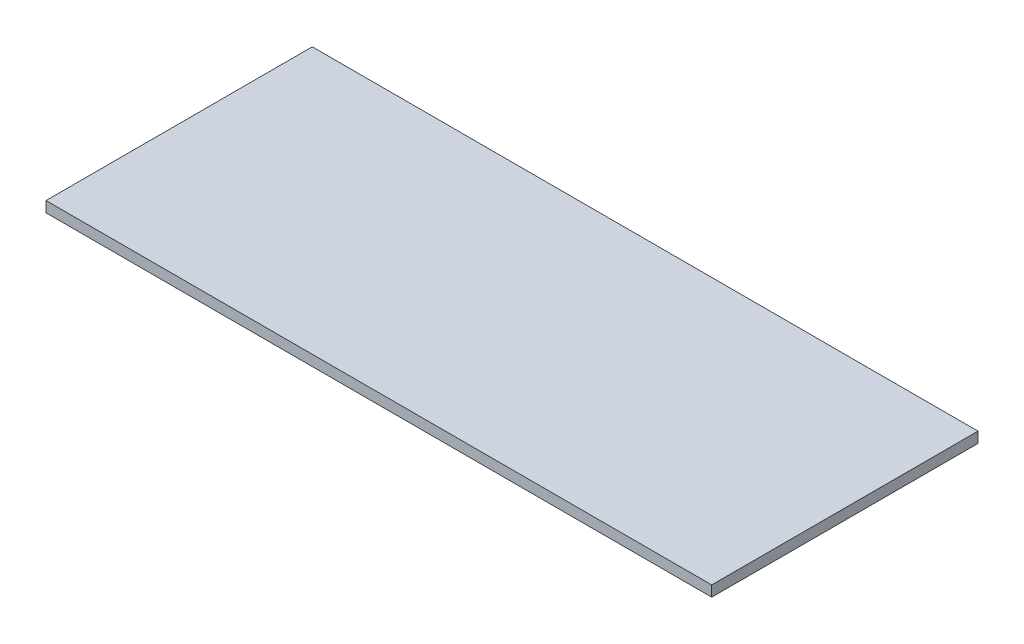
ISO-10303-21;
HEADER;
FILE_DESCRIPTION(('STEP AP214'),'2;1');
FILE_NAME('part.step','',(''),(''),'','','');
FILE_SCHEMA(('AUTOMOTIVE_DESIGN { 1 0 10303 214 1 1 1 1 }'));
ENDSEC;
DATA;
#1=APPLICATION_CONTEXT('core data for automotive mechanical design processes');
#2=APPLICATION_PROTOCOL_DEFINITION('international standard','automotive_design',2000,#1);
#3=PRODUCT_CONTEXT('',#1,'mechanical');
#4=PRODUCT('Part','Part','',(#3));
#5=PRODUCT_RELATED_PRODUCT_CATEGORY('part','',(#4));
#6=PRODUCT_DEFINITION_FORMATION('','',#4);
#7=PRODUCT_DEFINITION_CONTEXT('part definition',#1,'design');
#8=PRODUCT_DEFINITION('design','',#6,#7);
#9=PRODUCT_DEFINITION_SHAPE('','',#8);
#10=(LENGTH_UNIT() NAMED_UNIT(*) SI_UNIT(.MILLI.,.METRE.));
#11=(NAMED_UNIT(*) PLANE_ANGLE_UNIT() SI_UNIT($,.RADIAN.));
#12=(NAMED_UNIT(*) SI_UNIT($,.STERADIAN.) SOLID_ANGLE_UNIT());
#13=UNCERTAINTY_MEASURE_WITH_UNIT(LENGTH_MEASURE(1.E-05),#10,'distance_accuracy_value','');
#14=(GEOMETRIC_REPRESENTATION_CONTEXT(3) GLOBAL_UNCERTAINTY_ASSIGNED_CONTEXT((#13)) GLOBAL_UNIT_ASSIGNED_CONTEXT((#10,
#11,#12)) REPRESENTATION_CONTEXT('',''));
#15=CARTESIAN_POINT('',(0.,0.,0.));
#16=DIRECTION('',(0.,0.,1.));
#17=DIRECTION('',(1.,0.,0.));
#18=AXIS2_PLACEMENT_3D('',#15,#16,#17);
#19=CARTESIAN_POINT('',(0.,20.,0.));
#20=DIRECTION('',(1.,0.,0.));
#21=DIRECTION('',(0.,0.,-1.));
#22=AXIS2_PLACEMENT_3D('',#19,#20,#21);
#23=PLANE('',#22);
#24=DIRECTION('',(0.,0.,1.));
#25=VECTOR('',#24,1.);
#26=CARTESIAN_POINT('',(0.,0.,0.));
#27=LINE('',#26,#25);
#28=CARTESIAN_POINT('',(0.,0.,-500.));
#29=VERTEX_POINT('',#28);
#30=CARTESIAN_POINT('',(0.,0.,0.));
#31=VERTEX_POINT('',#30);
#32=EDGE_CURVE('E98',#29,#31,#27,.T.);
#33=ORIENTED_EDGE('',*,*,#32,.T.);
#34=DIRECTION('',(0.,-1.,0.));
#35=VECTOR('',#34,1.);
#36=CARTESIAN_POINT('',(0.,20.,0.));
#37=LINE('',#36,#35);
#38=CARTESIAN_POINT('',(0.,20.,0.));
#39=VERTEX_POINT('',#38);
#40=EDGE_CURVE('E11',#39,#31,#37,.T.);
#41=ORIENTED_EDGE('',*,*,#40,.F.);
#42=DIRECTION('',(0.,0.,1.));
#43=VECTOR('',#42,1.);
#44=CARTESIAN_POINT('',(0.,20.,0.));
#45=LINE('',#44,#43);
#46=CARTESIAN_POINT('',(0.,20.,-500.));
#47=VERTEX_POINT('',#46);
#48=EDGE_CURVE('E86',#47,#39,#45,.T.);
#49=ORIENTED_EDGE('',*,*,#48,.F.);
#50=DIRECTION('',(0.,-1.,0.));
#51=VECTOR('',#50,1.);
#52=CARTESIAN_POINT('',(0.,20.,-500.));
#53=LINE('',#52,#51);
#54=EDGE_CURVE('E94',#47,#29,#53,.T.);
#55=ORIENTED_EDGE('',*,*,#54,.T.);
#56=EDGE_LOOP('',(#33,#41,#49,#55));
#57=FACE_BOUND('',#56,.T.);
#58=ADVANCED_FACE('F35',(#57),#23,.F.);
#59=CARTESIAN_POINT('',(0.,20.,0.));
#60=DIRECTION('',(0.,0.,-1.));
#61=DIRECTION('',(-1.,0.,0.));
#62=AXIS2_PLACEMENT_3D('',#59,#60,#61);
#63=PLANE('',#62);
#64=DIRECTION('',(1.,0.,0.));
#65=VECTOR('',#64,1.);
#66=CARTESIAN_POINT('',(0.,0.,0.));
#67=LINE('',#66,#65);
#68=CARTESIAN_POINT('',(1250.,0.,0.));
#69=VERTEX_POINT('',#68);
#70=EDGE_CURVE('E90',#31,#69,#67,.T.);
#71=ORIENTED_EDGE('',*,*,#70,.T.);
#72=DIRECTION('',(0.,-1.,0.));
#73=VECTOR('',#72,1.);
#74=CARTESIAN_POINT('',(1250.,20.,0.));
#75=LINE('',#74,#73);
#76=CARTESIAN_POINT('',(1250.,20.,0.));
#77=VERTEX_POINT('',#76);
#78=EDGE_CURVE('E43',#77,#69,#75,.T.);
#79=ORIENTED_EDGE('',*,*,#78,.F.);
#80=DIRECTION('',(1.,0.,0.));
#81=VECTOR('',#80,1.);
#82=CARTESIAN_POINT('',(0.,20.,0.));
#83=LINE('',#82,#81);
#84=EDGE_CURVE('E81',#39,#77,#83,.T.);
#85=ORIENTED_EDGE('',*,*,#84,.F.);
#86=ORIENTED_EDGE('',*,*,#40,.T.);
#87=EDGE_LOOP('',(#71,#79,#85,#86));
#88=FACE_BOUND('',#87,.T.);
#89=ADVANCED_FACE('F89',(#88),#63,.F.);
#90=CARTESIAN_POINT('',(1250.,20.,0.));
#91=DIRECTION('',(-1.,0.,0.));
#92=DIRECTION('',(0.,0.,1.));
#93=AXIS2_PLACEMENT_3D('',#90,#91,#92);
#94=PLANE('',#93);
#95=DIRECTION('',(0.,0.,-1.));
#96=VECTOR('',#95,1.);
#97=CARTESIAN_POINT('',(1250.,0.,0.));
#98=LINE('',#97,#96);
#99=CARTESIAN_POINT('',(1250.,0.,-500.));
#100=VERTEX_POINT('',#99);
#101=EDGE_CURVE('E68',#69,#100,#98,.T.);
#102=ORIENTED_EDGE('',*,*,#101,.T.);
#103=DIRECTION('',(0.,-1.,0.));
#104=VECTOR('',#103,1.);
#105=CARTESIAN_POINT('',(1250.,20.,-500.));
#106=LINE('',#105,#104);
#107=CARTESIAN_POINT('',(1250.,20.,-500.));
#108=VERTEX_POINT('',#107);
#109=EDGE_CURVE('E91',#108,#100,#106,.T.);
#110=ORIENTED_EDGE('',*,*,#109,.F.);
#111=DIRECTION('',(0.,0.,-1.));
#112=VECTOR('',#111,1.);
#113=CARTESIAN_POINT('',(1250.,20.,0.));
#114=LINE('',#113,#112);
#115=EDGE_CURVE('E84',#77,#108,#114,.T.);
#116=ORIENTED_EDGE('',*,*,#115,.F.);
#117=ORIENTED_EDGE('',*,*,#78,.T.);
#118=EDGE_LOOP('',(#102,#110,#116,#117));
#119=FACE_BOUND('',#118,.T.);
#120=ADVANCED_FACE('F92',(#119),#94,.F.);
#121=CARTESIAN_POINT('',(0.,20.,-500.));
#122=DIRECTION('',(0.,0.,1.));
#123=DIRECTION('',(1.,0.,0.));
#124=AXIS2_PLACEMENT_3D('',#121,#122,#123);
#125=PLANE('',#124);
#126=DIRECTION('',(-1.,0.,0.));
#127=VECTOR('',#126,1.);
#128=CARTESIAN_POINT('',(0.,0.,-500.));
#129=LINE('',#128,#127);
#130=EDGE_CURVE('E74',#100,#29,#129,.T.);
#131=ORIENTED_EDGE('',*,*,#130,.T.);
#132=ORIENTED_EDGE('',*,*,#54,.F.);
#133=DIRECTION('',(-1.,0.,0.));
#134=VECTOR('',#133,1.);
#135=CARTESIAN_POINT('',(0.,20.,-500.));
#136=LINE('',#135,#134);
#137=EDGE_CURVE('E51',#108,#47,#136,.T.);
#138=ORIENTED_EDGE('',*,*,#137,.F.);
#139=ORIENTED_EDGE('',*,*,#109,.T.);
#140=EDGE_LOOP('',(#131,#132,#138,#139));
#141=FACE_BOUND('',#140,.T.);
#142=ADVANCED_FACE('F105',(#141),#125,.F.);
#143=CARTESIAN_POINT('',(0.,20.,0.));
#144=DIRECTION('',(0.,-1.,0.));
#145=DIRECTION('',(0.,0.,-1.));
#146=AXIS2_PLACEMENT_3D('',#143,#144,#145);
#147=PLANE('',#146);
#148=ORIENTED_EDGE('',*,*,#48,.T.);
#149=ORIENTED_EDGE('',*,*,#84,.T.);
#150=ORIENTED_EDGE('',*,*,#115,.T.);
#151=ORIENTED_EDGE('',*,*,#137,.T.);
#152=EDGE_LOOP('',(#148,#149,#150,#151));
#153=FACE_BOUND('',#152,.T.);
#154=ADVANCED_FACE('F82',(#153),#147,.F.);
#155=CARTESIAN_POINT('',(0.,0.,0.));
#156=DIRECTION('',(0.,-1.,0.));
#157=DIRECTION('',(0.,0.,-1.));
#158=AXIS2_PLACEMENT_3D('',#155,#156,#157);
#159=PLANE('',#158);
#160=ORIENTED_EDGE('',*,*,#32,.F.);
#161=ORIENTED_EDGE('',*,*,#130,.F.);
#162=ORIENTED_EDGE('',*,*,#101,.F.);
#163=ORIENTED_EDGE('',*,*,#70,.F.);
#164=EDGE_LOOP('',(#160,#161,#162,#163));
#165=FACE_BOUND('',#164,.T.);
#166=ADVANCED_FACE('F108',(#165),#159,.T.);
#167=CLOSED_SHELL('',(#58,#89,#120,#142,#154,#166));
#168=MANIFOLD_SOLID_BREP('B2',#167);
#169=ADVANCED_BREP_SHAPE_REPRESENTATION('',(#18,#168),#14);
#170=SHAPE_DEFINITION_REPRESENTATION(#9,#169);
ENDSEC;
END-ISO-10303-21;
